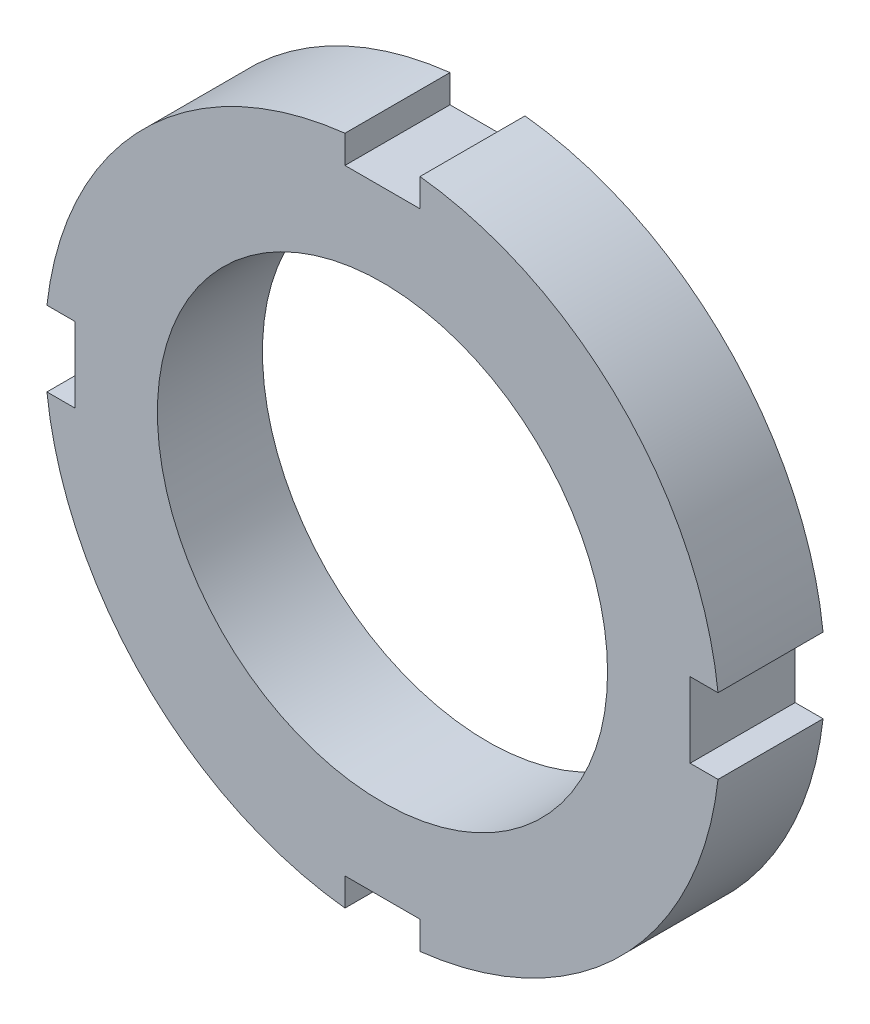
ISO-10303-21;
HEADER;
FILE_DESCRIPTION(('STEP AP214'),'2;1');
FILE_NAME('part.step','',(''),(''),'','','');
FILE_SCHEMA(('AUTOMOTIVE_DESIGN { 1 0 10303 214 1 1 1 1 }'));
ENDSEC;
DATA;
#1=APPLICATION_CONTEXT('core data for automotive mechanical design processes');
#2=APPLICATION_PROTOCOL_DEFINITION('international standard','automotive_design',2000,#1);
#3=PRODUCT_CONTEXT('',#1,'mechanical');
#4=PRODUCT('Part','Part','',(#3));
#5=PRODUCT_RELATED_PRODUCT_CATEGORY('part','',(#4));
#6=PRODUCT_DEFINITION_FORMATION('','',#4);
#7=PRODUCT_DEFINITION_CONTEXT('part definition',#1,'design');
#8=PRODUCT_DEFINITION('design','',#6,#7);
#9=PRODUCT_DEFINITION_SHAPE('','',#8);
#10=(LENGTH_UNIT() NAMED_UNIT(*) SI_UNIT(.MILLI.,.METRE.));
#11=(NAMED_UNIT(*) PLANE_ANGLE_UNIT() SI_UNIT($,.RADIAN.));
#12=(NAMED_UNIT(*) SI_UNIT($,.STERADIAN.) SOLID_ANGLE_UNIT());
#13=UNCERTAINTY_MEASURE_WITH_UNIT(LENGTH_MEASURE(1.E-05),#10,'distance_accuracy_value','');
#14=(GEOMETRIC_REPRESENTATION_CONTEXT(3) GLOBAL_UNCERTAINTY_ASSIGNED_CONTEXT((#13)) GLOBAL_UNIT_ASSIGNED_CONTEXT((#10,
#11,#12)) REPRESENTATION_CONTEXT('',''));
#15=CARTESIAN_POINT('',(0.,0.,0.));
#16=DIRECTION('',(0.,0.,1.));
#17=DIRECTION('',(1.,0.,0.));
#18=AXIS2_PLACEMENT_3D('',#15,#16,#17);
#19=CARTESIAN_POINT('',(15.,0.,-89.));
#20=DIRECTION('',(0.,0.,1.));
#21=DIRECTION('',(1.,0.,0.));
#22=AXIS2_PLACEMENT_3D('',#19,#20,#21);
#23=PLANE('',#22);
#24=CARTESIAN_POINT('',(0.,0.,-89.));
#25=DIRECTION('',(0.,0.,1.));
#26=DIRECTION('',(1.,0.,0.));
#27=AXIS2_PLACEMENT_3D('',#24,#25,#26);
#28=CIRCLE('',#27,15.);
#29=CARTESIAN_POINT('',(15.,0.,-89.));
#30=VERTEX_POINT('',#29);
#31=EDGE_CURVE('E263',#30,#30,#28,.T.);
#32=ORIENTED_EDGE('',*,*,#31,.F.);
#33=EDGE_LOOP('',(#32));
#34=FACE_BOUND('',#33,.T.);
#35=CARTESIAN_POINT('',(0.,0.,-89.));
#36=DIRECTION('',(0.,0.,1.));
#37=DIRECTION('',(1.,0.,0.));
#38=AXIS2_PLACEMENT_3D('',#35,#36,#37);
#39=CIRCLE('',#38,22.5);
#40=CARTESIAN_POINT('',(2.5,-22.3606797749979,-89.));
#41=VERTEX_POINT('',#40);
#42=CARTESIAN_POINT('',(22.3606797749979,-2.5,-89.));
#43=VERTEX_POINT('',#42);
#44=EDGE_CURVE('E260',#41,#43,#39,.T.);
#45=ORIENTED_EDGE('',*,*,#44,.T.);
#46=DIRECTION('',(-1.,0.,0.));
#47=VECTOR('',#46,1.);
#48=CARTESIAN_POINT('',(15.,-2.5,-89.));
#49=LINE('',#48,#47);
#50=CARTESIAN_POINT('',(20.5,-2.5,-89.));
#51=VERTEX_POINT('',#50);
#52=EDGE_CURVE('E238',#43,#51,#49,.T.);
#53=ORIENTED_EDGE('',*,*,#52,.T.);
#54=DIRECTION('',(0.,1.,0.));
#55=VECTOR('',#54,1.);
#56=CARTESIAN_POINT('',(20.5,0.,-89.));
#57=LINE('',#56,#55);
#58=CARTESIAN_POINT('',(20.5,2.5,-89.));
#59=VERTEX_POINT('',#58);
#60=EDGE_CURVE('E244',#51,#59,#57,.T.);
#61=ORIENTED_EDGE('',*,*,#60,.T.);
#62=DIRECTION('',(1.,0.,0.));
#63=VECTOR('',#62,1.);
#64=CARTESIAN_POINT('',(15.,2.5,-89.));
#65=LINE('',#64,#63);
#66=CARTESIAN_POINT('',(22.3606797749979,2.5,-89.));
#67=VERTEX_POINT('',#66);
#68=EDGE_CURVE('E235',#59,#67,#65,.T.);
#69=ORIENTED_EDGE('',*,*,#68,.T.);
#70=CARTESIAN_POINT('',(2.5,22.3606797749979,-89.));
#71=VERTEX_POINT('',#70);
#72=EDGE_CURVE('E259',#67,#71,#39,.T.);
#73=ORIENTED_EDGE('',*,*,#72,.T.);
#74=DIRECTION('',(0.,-1.,0.));
#75=VECTOR('',#74,1.);
#76=CARTESIAN_POINT('',(2.5,0.,-89.));
#77=LINE('',#76,#75);
#78=CARTESIAN_POINT('',(2.5,20.5,-89.));
#79=VERTEX_POINT('',#78);
#80=EDGE_CURVE('E186',#71,#79,#77,.T.);
#81=ORIENTED_EDGE('',*,*,#80,.T.);
#82=DIRECTION('',(-1.,0.,0.));
#83=VECTOR('',#82,1.);
#84=CARTESIAN_POINT('',(15.,20.5,-89.));
#85=LINE('',#84,#83);
#86=CARTESIAN_POINT('',(-2.5,20.5,-89.));
#87=VERTEX_POINT('',#86);
#88=EDGE_CURVE('E197',#79,#87,#85,.T.);
#89=ORIENTED_EDGE('',*,*,#88,.T.);
#90=DIRECTION('',(0.,1.,0.));
#91=VECTOR('',#90,1.);
#92=CARTESIAN_POINT('',(-2.5,0.,-89.));
#93=LINE('',#92,#91);
#94=CARTESIAN_POINT('',(-2.5,22.3606797749979,-89.));
#95=VERTEX_POINT('',#94);
#96=EDGE_CURVE('E202',#87,#95,#93,.T.);
#97=ORIENTED_EDGE('',*,*,#96,.T.);
#98=CARTESIAN_POINT('',(-22.3606797749979,2.5,-89.));
#99=VERTEX_POINT('',#98);
#100=EDGE_CURVE('E262',#95,#99,#39,.T.);
#101=ORIENTED_EDGE('',*,*,#100,.T.);
#102=DIRECTION('',(1.,0.,0.));
#103=VECTOR('',#102,1.);
#104=CARTESIAN_POINT('',(15.,2.5,-89.));
#105=LINE('',#104,#103);
#106=CARTESIAN_POINT('',(-20.5,2.5,-89.));
#107=VERTEX_POINT('',#106);
#108=EDGE_CURVE('E213',#99,#107,#105,.T.);
#109=ORIENTED_EDGE('',*,*,#108,.T.);
#110=DIRECTION('',(0.,-1.,0.));
#111=VECTOR('',#110,1.);
#112=CARTESIAN_POINT('',(-20.5,0.,-89.));
#113=LINE('',#112,#111);
#114=CARTESIAN_POINT('',(-20.5,-2.5,-89.));
#115=VERTEX_POINT('',#114);
#116=EDGE_CURVE('E220',#107,#115,#113,.T.);
#117=ORIENTED_EDGE('',*,*,#116,.T.);
#118=DIRECTION('',(-1.,0.,0.));
#119=VECTOR('',#118,1.);
#120=CARTESIAN_POINT('',(15.,-2.5,-89.));
#121=LINE('',#120,#119);
#122=CARTESIAN_POINT('',(-22.3606797749979,-2.5,-89.));
#123=VERTEX_POINT('',#122);
#124=EDGE_CURVE('E223',#115,#123,#121,.T.);
#125=ORIENTED_EDGE('',*,*,#124,.T.);
#126=CARTESIAN_POINT('',(-2.5,-22.3606797749979,-89.));
#127=VERTEX_POINT('',#126);
#128=EDGE_CURVE('E178',#123,#127,#39,.T.);
#129=ORIENTED_EDGE('',*,*,#128,.T.);
#130=DIRECTION('',(0.,1.,0.));
#131=VECTOR('',#130,1.);
#132=CARTESIAN_POINT('',(-2.5,0.,-89.));
#133=LINE('',#132,#131);
#134=CARTESIAN_POINT('',(-2.5,-20.5,-89.));
#135=VERTEX_POINT('',#134);
#136=EDGE_CURVE('E170',#127,#135,#133,.T.);
#137=ORIENTED_EDGE('',*,*,#136,.T.);
#138=DIRECTION('',(1.,0.,0.));
#139=VECTOR('',#138,1.);
#140=CARTESIAN_POINT('',(15.,-20.5,-89.));
#141=LINE('',#140,#139);
#142=CARTESIAN_POINT('',(2.5,-20.5,-89.));
#143=VERTEX_POINT('',#142);
#144=EDGE_CURVE('E152',#135,#143,#141,.T.);
#145=ORIENTED_EDGE('',*,*,#144,.T.);
#146=DIRECTION('',(0.,-1.,0.));
#147=VECTOR('',#146,1.);
#148=CARTESIAN_POINT('',(2.5,0.,-89.));
#149=LINE('',#148,#147);
#150=EDGE_CURVE('E187',#143,#41,#149,.T.);
#151=ORIENTED_EDGE('',*,*,#150,.T.);
#152=EDGE_LOOP('',(#45,#53,#61,#69,#73,#81,#89,#97,#101,#109,#117,#125,#129,#137,#145,#151));
#153=FACE_BOUND('',#152,.T.);
#154=ADVANCED_FACE('F41',(#34,#153),#23,.T.);
#155=CARTESIAN_POINT('',(0.,0.,150.));
#156=DIRECTION('',(0.,0.,1.));
#157=DIRECTION('',(1.,0.,0.));
#158=AXIS2_PLACEMENT_3D('',#155,#156,#157);
#159=CYLINDRICAL_SURFACE('',#158,22.5);
#160=CARTESIAN_POINT('',(0.,0.,-96.));
#161=DIRECTION('',(0.,0.,1.));
#162=DIRECTION('',(1.,0.,0.));
#163=AXIS2_PLACEMENT_3D('',#160,#161,#162);
#164=CIRCLE('',#163,22.5);
#165=CARTESIAN_POINT('',(2.5,-22.3606797749979,-96.));
#166=VERTEX_POINT('',#165);
#167=CARTESIAN_POINT('',(22.3606797749979,-2.5,-96.));
#168=VERTEX_POINT('',#167);
#169=EDGE_CURVE('E252',#166,#168,#164,.T.);
#170=ORIENTED_EDGE('',*,*,#169,.T.);
#171=DIRECTION('',(0.,0.,1.));
#172=VECTOR('',#171,1.);
#173=CARTESIAN_POINT('',(22.3606797749979,-2.5,150.));
#174=LINE('',#173,#172);
#175=EDGE_CURVE('E237',#168,#43,#174,.T.);
#176=ORIENTED_EDGE('',*,*,#175,.T.);
#177=ORIENTED_EDGE('',*,*,#44,.F.);
#178=DIRECTION('',(0.,0.,1.));
#179=VECTOR('',#178,1.);
#180=CARTESIAN_POINT('',(2.5,-22.3606797749979,150.));
#181=LINE('',#180,#179);
#182=EDGE_CURVE('E165',#41,#166,#181,.F.);
#183=ORIENTED_EDGE('',*,*,#182,.T.);
#184=EDGE_LOOP('',(#170,#176,#177,#183));
#185=FACE_BOUND('',#184,.T.);
#186=ADVANCED_FACE('F350',(#185),#159,.T.);
#187=ORIENTED_EDGE('',*,*,#72,.F.);
#188=DIRECTION('',(0.,0.,1.));
#189=VECTOR('',#188,1.);
#190=CARTESIAN_POINT('',(22.3606797749979,2.5,150.));
#191=LINE('',#190,#189);
#192=CARTESIAN_POINT('',(22.3606797749979,2.5,-96.));
#193=VERTEX_POINT('',#192);
#194=EDGE_CURVE('E226',#67,#193,#191,.F.);
#195=ORIENTED_EDGE('',*,*,#194,.T.);
#196=CARTESIAN_POINT('',(2.5,22.3606797749979,-96.));
#197=VERTEX_POINT('',#196);
#198=EDGE_CURVE('E251',#193,#197,#164,.T.);
#199=ORIENTED_EDGE('',*,*,#198,.T.);
#200=DIRECTION('',(0.,0.,1.));
#201=VECTOR('',#200,1.);
#202=CARTESIAN_POINT('',(2.5,22.3606797749979,150.));
#203=LINE('',#202,#201);
#204=EDGE_CURVE('E182',#197,#71,#203,.T.);
#205=ORIENTED_EDGE('',*,*,#204,.T.);
#206=EDGE_LOOP('',(#187,#195,#199,#205));
#207=FACE_BOUND('',#206,.T.);
#208=ADVANCED_FACE('F393',(#207),#159,.T.);
#209=ORIENTED_EDGE('',*,*,#128,.F.);
#210=DIRECTION('',(0.,0.,1.));
#211=VECTOR('',#210,1.);
#212=CARTESIAN_POINT('',(-22.3606797749979,-2.5,150.));
#213=LINE('',#212,#211);
#214=CARTESIAN_POINT('',(-22.3606797749979,-2.5,-96.));
#215=VERTEX_POINT('',#214);
#216=EDGE_CURVE('E222',#123,#215,#213,.F.);
#217=ORIENTED_EDGE('',*,*,#216,.T.);
#218=CARTESIAN_POINT('',(-2.5,-22.3606797749979,-96.));
#219=VERTEX_POINT('',#218);
#220=EDGE_CURVE('E375',#215,#219,#164,.T.);
#221=ORIENTED_EDGE('',*,*,#220,.T.);
#222=DIRECTION('',(0.,0.,1.));
#223=VECTOR('',#222,1.);
#224=CARTESIAN_POINT('',(-2.5,-22.3606797749979,150.));
#225=LINE('',#224,#223);
#226=EDGE_CURVE('E185',#219,#127,#225,.T.);
#227=ORIENTED_EDGE('',*,*,#226,.T.);
#228=EDGE_LOOP('',(#209,#217,#221,#227));
#229=FACE_BOUND('',#228,.T.);
#230=ADVANCED_FACE('F367',(#229),#159,.T.);
#231=CARTESIAN_POINT('',(-2.5,22.3606797749979,-96.));
#232=VERTEX_POINT('',#231);
#233=CARTESIAN_POINT('',(-22.3606797749979,2.5,-96.));
#234=VERTEX_POINT('',#233);
#235=EDGE_CURVE('E256',#232,#234,#164,.T.);
#236=ORIENTED_EDGE('',*,*,#235,.T.);
#237=DIRECTION('',(0.,0.,1.));
#238=VECTOR('',#237,1.);
#239=CARTESIAN_POINT('',(-22.3606797749979,2.5,150.));
#240=LINE('',#239,#238);
#241=EDGE_CURVE('E207',#234,#99,#240,.T.);
#242=ORIENTED_EDGE('',*,*,#241,.T.);
#243=ORIENTED_EDGE('',*,*,#100,.F.);
#244=DIRECTION('',(0.,0.,1.));
#245=VECTOR('',#244,1.);
#246=CARTESIAN_POINT('',(-2.5,22.3606797749979,150.));
#247=LINE('',#246,#245);
#248=EDGE_CURVE('E203',#95,#232,#247,.F.);
#249=ORIENTED_EDGE('',*,*,#248,.T.);
#250=EDGE_LOOP('',(#236,#242,#243,#249));
#251=FACE_BOUND('',#250,.T.);
#252=ADVANCED_FACE('F357',(#251),#159,.T.);
#253=CARTESIAN_POINT('',(22.5,0.,-96.));
#254=DIRECTION('',(0.,0.,-1.));
#255=DIRECTION('',(-1.,0.,0.));
#256=AXIS2_PLACEMENT_3D('',#253,#254,#255);
#257=PLANE('',#256);
#258=CARTESIAN_POINT('',(0.,0.,-96.));
#259=DIRECTION('',(0.,0.,1.));
#260=DIRECTION('',(1.,0.,0.));
#261=AXIS2_PLACEMENT_3D('',#258,#259,#260);
#262=CIRCLE('',#261,15.);
#263=CARTESIAN_POINT('',(15.,0.,-96.));
#264=VERTEX_POINT('',#263);
#265=EDGE_CURVE('E247',#264,#264,#262,.T.);
#266=ORIENTED_EDGE('',*,*,#265,.T.);
#267=EDGE_LOOP('',(#266));
#268=FACE_BOUND('',#267,.T.);
#269=DIRECTION('',(0.,-1.,0.));
#270=VECTOR('',#269,1.);
#271=CARTESIAN_POINT('',(20.5,0.,-96.));
#272=LINE('',#271,#270);
#273=CARTESIAN_POINT('',(20.5,2.5,-96.));
#274=VERTEX_POINT('',#273);
#275=CARTESIAN_POINT('',(20.5,-2.5,-96.));
#276=VERTEX_POINT('',#275);
#277=EDGE_CURVE('E49',#274,#276,#272,.T.);
#278=ORIENTED_EDGE('',*,*,#277,.T.);
#279=DIRECTION('',(1.,0.,0.));
#280=VECTOR('',#279,1.);
#281=CARTESIAN_POINT('',(22.5,-2.5,-96.));
#282=LINE('',#281,#280);
#283=EDGE_CURVE('E11',#276,#168,#282,.T.);
#284=ORIENTED_EDGE('',*,*,#283,.T.);
#285=ORIENTED_EDGE('',*,*,#169,.F.);
#286=DIRECTION('',(0.,1.,0.));
#287=VECTOR('',#286,1.);
#288=CARTESIAN_POINT('',(2.5,0.,-96.));
#289=LINE('',#288,#287);
#290=CARTESIAN_POINT('',(2.5,-20.5,-96.));
#291=VERTEX_POINT('',#290);
#292=EDGE_CURVE('E271',#166,#291,#289,.T.);
#293=ORIENTED_EDGE('',*,*,#292,.T.);
#294=DIRECTION('',(-1.,0.,0.));
#295=VECTOR('',#294,1.);
#296=CARTESIAN_POINT('',(22.5,-20.5,-96.));
#297=LINE('',#296,#295);
#298=CARTESIAN_POINT('',(-2.5,-20.5,-96.));
#299=VERTEX_POINT('',#298);
#300=EDGE_CURVE('E268',#291,#299,#297,.T.);
#301=ORIENTED_EDGE('',*,*,#300,.T.);
#302=DIRECTION('',(0.,-1.,0.));
#303=VECTOR('',#302,1.);
#304=CARTESIAN_POINT('',(-2.5,0.,-96.));
#305=LINE('',#304,#303);
#306=EDGE_CURVE('E168',#299,#219,#305,.T.);
#307=ORIENTED_EDGE('',*,*,#306,.T.);
#308=ORIENTED_EDGE('',*,*,#220,.F.);
#309=DIRECTION('',(1.,0.,0.));
#310=VECTOR('',#309,1.);
#311=CARTESIAN_POINT('',(22.5,-2.5,-96.));
#312=LINE('',#311,#310);
#313=CARTESIAN_POINT('',(-20.5,-2.5,-96.));
#314=VERTEX_POINT('',#313);
#315=EDGE_CURVE('E300',#215,#314,#312,.T.);
#316=ORIENTED_EDGE('',*,*,#315,.T.);
#317=DIRECTION('',(0.,1.,0.));
#318=VECTOR('',#317,1.);
#319=CARTESIAN_POINT('',(-20.5,0.,-96.));
#320=LINE('',#319,#318);
#321=CARTESIAN_POINT('',(-20.5,2.5,-96.));
#322=VERTEX_POINT('',#321);
#323=EDGE_CURVE('E291',#314,#322,#320,.T.);
#324=ORIENTED_EDGE('',*,*,#323,.T.);
#325=DIRECTION('',(-1.,0.,0.));
#326=VECTOR('',#325,1.);
#327=CARTESIAN_POINT('',(22.5,2.5,-96.));
#328=LINE('',#327,#326);
#329=EDGE_CURVE('E288',#322,#234,#328,.T.);
#330=ORIENTED_EDGE('',*,*,#329,.T.);
#331=ORIENTED_EDGE('',*,*,#235,.F.);
#332=DIRECTION('',(0.,-1.,0.));
#333=VECTOR('',#332,1.);
#334=CARTESIAN_POINT('',(-2.5,0.,-96.));
#335=LINE('',#334,#333);
#336=CARTESIAN_POINT('',(-2.5,20.5,-96.));
#337=VERTEX_POINT('',#336);
#338=EDGE_CURVE('E282',#232,#337,#335,.T.);
#339=ORIENTED_EDGE('',*,*,#338,.T.);
#340=DIRECTION('',(1.,0.,0.));
#341=VECTOR('',#340,1.);
#342=CARTESIAN_POINT('',(22.5,20.5,-96.));
#343=LINE('',#342,#341);
#344=CARTESIAN_POINT('',(2.5,20.5,-96.));
#345=VERTEX_POINT('',#344);
#346=EDGE_CURVE('E283',#337,#345,#343,.T.);
#347=ORIENTED_EDGE('',*,*,#346,.T.);
#348=DIRECTION('',(0.,1.,0.));
#349=VECTOR('',#348,1.);
#350=CARTESIAN_POINT('',(2.5,0.,-96.));
#351=LINE('',#350,#349);
#352=EDGE_CURVE('E280',#345,#197,#351,.T.);
#353=ORIENTED_EDGE('',*,*,#352,.T.);
#354=ORIENTED_EDGE('',*,*,#198,.F.);
#355=DIRECTION('',(-1.,0.,0.));
#356=VECTOR('',#355,1.);
#357=CARTESIAN_POINT('',(22.5,2.5,-96.));
#358=LINE('',#357,#356);
#359=EDGE_CURVE('E301',#193,#274,#358,.T.);
#360=ORIENTED_EDGE('',*,*,#359,.T.);
#361=EDGE_LOOP('',(#278,#284,#285,#293,#301,#307,#308,#316,#324,#330,#331,#339,#347,#353,#354,#360));
#362=FACE_BOUND('',#361,.T.);
#363=ADVANCED_FACE('F306',(#268,#362),#257,.T.);
#364=CARTESIAN_POINT('',(0.,0.,150.));
#365=DIRECTION('',(0.,0.,1.));
#366=DIRECTION('',(1.,0.,0.));
#367=AXIS2_PLACEMENT_3D('',#364,#365,#366);
#368=CYLINDRICAL_SURFACE('',#367,15.);
#369=ORIENTED_EDGE('',*,*,#31,.T.);
#370=EDGE_LOOP('',(#369));
#371=FACE_BOUND('',#370,.T.);
#372=ORIENTED_EDGE('',*,*,#265,.F.);
#373=EDGE_LOOP('',(#372));
#374=FACE_BOUND('',#373,.T.);
#375=ADVANCED_FACE('F43',(#371,#374),#368,.F.);
#376=CARTESIAN_POINT('',(-2.5,-23.5,150.));
#377=DIRECTION('',(1.,0.,0.));
#378=DIRECTION('',(0.,0.,-1.));
#379=AXIS2_PLACEMENT_3D('',#376,#377,#378);
#380=PLANE('',#379);
#381=ORIENTED_EDGE('',*,*,#226,.F.);
#382=ORIENTED_EDGE('',*,*,#306,.F.);
#383=DIRECTION('',(0.,0.,-1.));
#384=VECTOR('',#383,1.);
#385=CARTESIAN_POINT('',(-2.5,-20.5,150.));
#386=LINE('',#385,#384);
#387=EDGE_CURVE('E62',#135,#299,#386,.T.);
#388=ORIENTED_EDGE('',*,*,#387,.F.);
#389=ORIENTED_EDGE('',*,*,#136,.F.);
#390=EDGE_LOOP('',(#381,#382,#388,#389));
#391=FACE_BOUND('',#390,.T.);
#392=ADVANCED_FACE('F167',(#391),#380,.T.);
#393=CARTESIAN_POINT('',(2.5,-23.5,150.));
#394=DIRECTION('',(-1.,0.,0.));
#395=DIRECTION('',(0.,0.,1.));
#396=AXIS2_PLACEMENT_3D('',#393,#394,#395);
#397=PLANE('',#396);
#398=DIRECTION('',(0.,0.,-1.));
#399=VECTOR('',#398,1.);
#400=CARTESIAN_POINT('',(2.5,-20.5,150.));
#401=LINE('',#400,#399);
#402=EDGE_CURVE('E160',#143,#291,#401,.T.);
#403=ORIENTED_EDGE('',*,*,#402,.T.);
#404=ORIENTED_EDGE('',*,*,#292,.F.);
#405=ORIENTED_EDGE('',*,*,#182,.F.);
#406=ORIENTED_EDGE('',*,*,#150,.F.);
#407=EDGE_LOOP('',(#403,#404,#405,#406));
#408=FACE_BOUND('',#407,.T.);
#409=ADVANCED_FACE('F373',(#408),#397,.T.);
#410=CARTESIAN_POINT('',(-2.5,-20.5,150.));
#411=DIRECTION('',(0.,-1.,0.));
#412=DIRECTION('',(0.,0.,-1.));
#413=AXIS2_PLACEMENT_3D('',#410,#411,#412);
#414=PLANE('',#413);
#415=ORIENTED_EDGE('',*,*,#387,.T.);
#416=ORIENTED_EDGE('',*,*,#300,.F.);
#417=ORIENTED_EDGE('',*,*,#402,.F.);
#418=ORIENTED_EDGE('',*,*,#144,.F.);
#419=EDGE_LOOP('',(#415,#416,#417,#418));
#420=FACE_BOUND('',#419,.T.);
#421=ADVANCED_FACE('F154',(#420),#414,.T.);
#422=CARTESIAN_POINT('',(-2.5,20.5,150.));
#423=DIRECTION('',(1.,0.,0.));
#424=DIRECTION('',(0.,0.,-1.));
#425=AXIS2_PLACEMENT_3D('',#422,#423,#424);
#426=PLANE('',#425);
#427=DIRECTION('',(0.,0.,-1.));
#428=VECTOR('',#427,1.);
#429=CARTESIAN_POINT('',(-2.5,20.5,150.));
#430=LINE('',#429,#428);
#431=EDGE_CURVE('E171',#87,#337,#430,.T.);
#432=ORIENTED_EDGE('',*,*,#431,.T.);
#433=ORIENTED_EDGE('',*,*,#338,.F.);
#434=ORIENTED_EDGE('',*,*,#248,.F.);
#435=ORIENTED_EDGE('',*,*,#96,.F.);
#436=EDGE_LOOP('',(#432,#433,#434,#435));
#437=FACE_BOUND('',#436,.T.);
#438=ADVANCED_FACE('F381',(#437),#426,.T.);
#439=CARTESIAN_POINT('',(-2.5,20.5,150.));
#440=DIRECTION('',(0.,1.,0.));
#441=DIRECTION('',(0.,0.,1.));
#442=AXIS2_PLACEMENT_3D('',#439,#440,#441);
#443=PLANE('',#442);
#444=DIRECTION('',(0.,0.,-1.));
#445=VECTOR('',#444,1.);
#446=CARTESIAN_POINT('',(2.5,20.5,150.));
#447=LINE('',#446,#445);
#448=EDGE_CURVE('E327',#79,#345,#447,.T.);
#449=ORIENTED_EDGE('',*,*,#448,.T.);
#450=ORIENTED_EDGE('',*,*,#346,.F.);
#451=ORIENTED_EDGE('',*,*,#431,.F.);
#452=ORIENTED_EDGE('',*,*,#88,.F.);
#453=EDGE_LOOP('',(#449,#450,#451,#452));
#454=FACE_BOUND('',#453,.T.);
#455=ADVANCED_FACE('F436',(#454),#443,.T.);
#456=CARTESIAN_POINT('',(2.5,20.5,150.));
#457=DIRECTION('',(-1.,0.,0.));
#458=DIRECTION('',(0.,0.,1.));
#459=AXIS2_PLACEMENT_3D('',#456,#457,#458);
#460=PLANE('',#459);
#461=ORIENTED_EDGE('',*,*,#204,.F.);
#462=ORIENTED_EDGE('',*,*,#352,.F.);
#463=ORIENTED_EDGE('',*,*,#448,.F.);
#464=ORIENTED_EDGE('',*,*,#80,.F.);
#465=EDGE_LOOP('',(#461,#462,#463,#464));
#466=FACE_BOUND('',#465,.T.);
#467=ADVANCED_FACE('F427',(#466),#460,.T.);
#468=CARTESIAN_POINT('',(-23.5,-2.5,150.));
#469=DIRECTION('',(0.,1.,0.));
#470=DIRECTION('',(0.,0.,1.));
#471=AXIS2_PLACEMENT_3D('',#468,#469,#470);
#472=PLANE('',#471);
#473=DIRECTION('',(0.,0.,-1.));
#474=VECTOR('',#473,1.);
#475=CARTESIAN_POINT('',(-20.5,-2.5,150.));
#476=LINE('',#475,#474);
#477=EDGE_CURVE('E322',#115,#314,#476,.T.);
#478=ORIENTED_EDGE('',*,*,#477,.T.);
#479=ORIENTED_EDGE('',*,*,#315,.F.);
#480=ORIENTED_EDGE('',*,*,#216,.F.);
#481=ORIENTED_EDGE('',*,*,#124,.F.);
#482=EDGE_LOOP('',(#478,#479,#480,#481));
#483=FACE_BOUND('',#482,.T.);
#484=ADVANCED_FACE('F366',(#483),#472,.T.);
#485=CARTESIAN_POINT('',(-20.5,-2.5,150.));
#486=DIRECTION('',(-1.,0.,0.));
#487=DIRECTION('',(0.,0.,1.));
#488=AXIS2_PLACEMENT_3D('',#485,#486,#487);
#489=PLANE('',#488);
#490=DIRECTION('',(0.,0.,-1.));
#491=VECTOR('',#490,1.);
#492=CARTESIAN_POINT('',(-20.5,2.5,150.));
#493=LINE('',#492,#491);
#494=EDGE_CURVE('E321',#107,#322,#493,.T.);
#495=ORIENTED_EDGE('',*,*,#494,.T.);
#496=ORIENTED_EDGE('',*,*,#323,.F.);
#497=ORIENTED_EDGE('',*,*,#477,.F.);
#498=ORIENTED_EDGE('',*,*,#116,.F.);
#499=EDGE_LOOP('',(#495,#496,#497,#498));
#500=FACE_BOUND('',#499,.T.);
#501=ADVANCED_FACE('F368',(#500),#489,.T.);
#502=CARTESIAN_POINT('',(-23.5,2.5,150.));
#503=DIRECTION('',(0.,-1.,0.));
#504=DIRECTION('',(0.,0.,-1.));
#505=AXIS2_PLACEMENT_3D('',#502,#503,#504);
#506=PLANE('',#505);
#507=ORIENTED_EDGE('',*,*,#241,.F.);
#508=ORIENTED_EDGE('',*,*,#329,.F.);
#509=ORIENTED_EDGE('',*,*,#494,.F.);
#510=ORIENTED_EDGE('',*,*,#108,.F.);
#511=EDGE_LOOP('',(#507,#508,#509,#510));
#512=FACE_BOUND('',#511,.T.);
#513=ADVANCED_FACE('F363',(#512),#506,.T.);
#514=CARTESIAN_POINT('',(20.5,-2.5,150.));
#515=DIRECTION('',(1.,0.,0.));
#516=DIRECTION('',(0.,0.,-1.));
#517=AXIS2_PLACEMENT_3D('',#514,#515,#516);
#518=PLANE('',#517);
#519=DIRECTION('',(0.,0.,-1.));
#520=VECTOR('',#519,1.);
#521=CARTESIAN_POINT('',(20.5,-2.5,150.));
#522=LINE('',#521,#520);
#523=EDGE_CURVE('E162',#51,#276,#522,.T.);
#524=ORIENTED_EDGE('',*,*,#523,.T.);
#525=ORIENTED_EDGE('',*,*,#277,.F.);
#526=DIRECTION('',(0.,0.,-1.));
#527=VECTOR('',#526,1.);
#528=CARTESIAN_POINT('',(20.5,2.5,150.));
#529=LINE('',#528,#527);
#530=EDGE_CURVE('E60',#59,#274,#529,.T.);
#531=ORIENTED_EDGE('',*,*,#530,.F.);
#532=ORIENTED_EDGE('',*,*,#60,.F.);
#533=EDGE_LOOP('',(#524,#525,#531,#532));
#534=FACE_BOUND('',#533,.T.);
#535=ADVANCED_FACE('F314',(#534),#518,.T.);
#536=CARTESIAN_POINT('',(20.5,-2.5,150.));
#537=DIRECTION('',(0.,1.,0.));
#538=DIRECTION('',(0.,0.,1.));
#539=AXIS2_PLACEMENT_3D('',#536,#537,#538);
#540=PLANE('',#539);
#541=ORIENTED_EDGE('',*,*,#175,.F.);
#542=ORIENTED_EDGE('',*,*,#283,.F.);
#543=ORIENTED_EDGE('',*,*,#523,.F.);
#544=ORIENTED_EDGE('',*,*,#52,.F.);
#545=EDGE_LOOP('',(#541,#542,#543,#544));
#546=FACE_BOUND('',#545,.T.);
#547=ADVANCED_FACE('F417',(#546),#540,.T.);
#548=CARTESIAN_POINT('',(20.5,2.5,150.));
#549=DIRECTION('',(0.,-1.,0.));
#550=DIRECTION('',(0.,0.,-1.));
#551=AXIS2_PLACEMENT_3D('',#548,#549,#550);
#552=PLANE('',#551);
#553=ORIENTED_EDGE('',*,*,#530,.T.);
#554=ORIENTED_EDGE('',*,*,#359,.F.);
#555=ORIENTED_EDGE('',*,*,#194,.F.);
#556=ORIENTED_EDGE('',*,*,#68,.F.);
#557=EDGE_LOOP('',(#553,#554,#555,#556));
#558=FACE_BOUND('',#557,.T.);
#559=ADVANCED_FACE('F414',(#558),#552,.T.);
#560=CLOSED_SHELL('',(#154,#186,#208,#230,#252,#363,#375,#392,#409,#421,#438,#455,#467,#484,
#501,#513,#535,#547,#559));
#561=MANIFOLD_SOLID_BREP('B2',#560);
#562=ADVANCED_BREP_SHAPE_REPRESENTATION('',(#18,#561),#14);
#563=SHAPE_DEFINITION_REPRESENTATION(#9,#562);
ENDSEC;
END-ISO-10303-21;
